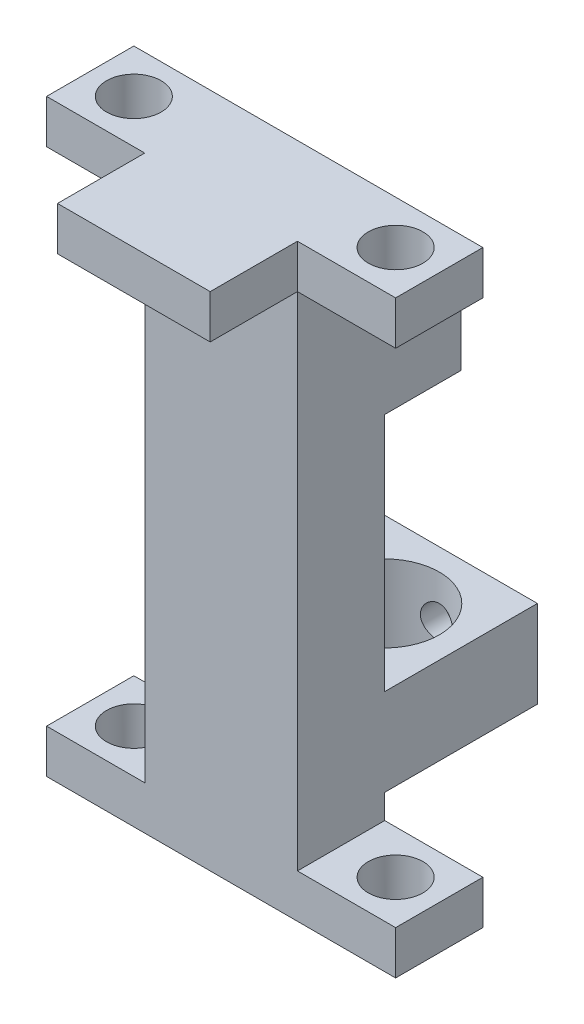
ISO-10303-21;
HEADER;
FILE_DESCRIPTION(('STEP AP214'),'2;1');
FILE_NAME('part.step','',(''),(''),'','','');
FILE_SCHEMA(('AUTOMOTIVE_DESIGN { 1 0 10303 214 1 1 1 1 }'));
ENDSEC;
DATA;
#1=APPLICATION_CONTEXT('core data for automotive mechanical design processes');
#2=APPLICATION_PROTOCOL_DEFINITION('international standard','automotive_design',2000,#1);
#3=PRODUCT_CONTEXT('',#1,'mechanical');
#4=PRODUCT('Part','Part','',(#3));
#5=PRODUCT_RELATED_PRODUCT_CATEGORY('part','',(#4));
#6=PRODUCT_DEFINITION_FORMATION('','',#4);
#7=PRODUCT_DEFINITION_CONTEXT('part definition',#1,'design');
#8=PRODUCT_DEFINITION('design','',#6,#7);
#9=PRODUCT_DEFINITION_SHAPE('','',#8);
#10=(LENGTH_UNIT() NAMED_UNIT(*) SI_UNIT(.MILLI.,.METRE.));
#11=(NAMED_UNIT(*) PLANE_ANGLE_UNIT() SI_UNIT($,.RADIAN.));
#12=(NAMED_UNIT(*) SI_UNIT($,.STERADIAN.) SOLID_ANGLE_UNIT());
#13=UNCERTAINTY_MEASURE_WITH_UNIT(LENGTH_MEASURE(1.E-05),#10,'distance_accuracy_value','');
#14=(GEOMETRIC_REPRESENTATION_CONTEXT(3) GLOBAL_UNCERTAINTY_ASSIGNED_CONTEXT((#13)) GLOBAL_UNIT_ASSIGNED_CONTEXT((#10,
#11,#12)) REPRESENTATION_CONTEXT('',''));
#15=CARTESIAN_POINT('',(0.,0.,0.));
#16=DIRECTION('',(0.,0.,1.));
#17=DIRECTION('',(1.,0.,0.));
#18=AXIS2_PLACEMENT_3D('',#15,#16,#17);
#19=CARTESIAN_POINT('',(0.,0.,-7.));
#20=DIRECTION('',(0.,0.,-1.));
#21=DIRECTION('',(-1.,0.,0.));
#22=AXIS2_PLACEMENT_3D('',#19,#20,#21);
#23=PLANE('',#22);
#24=DIRECTION('',(0.,1.,0.));
#25=VECTOR('',#24,1.);
#26=CARTESIAN_POINT('',(21.,36.2403096637996,-7.));
#27=LINE('',#26,#25);
#28=CARTESIAN_POINT('',(21.,36.2403096637996,-7.));
#29=VERTEX_POINT('',#28);
#30=CARTESIAN_POINT('',(21.,42.2403096637996,-7.));
#31=VERTEX_POINT('',#30);
#32=EDGE_CURVE('E550',#29,#31,#27,.T.);
#33=ORIENTED_EDGE('',*,*,#32,.T.);
#34=DIRECTION('',(1.,0.,0.));
#35=VECTOR('',#34,1.);
#36=CARTESIAN_POINT('',(23.,42.2403096637996,-7.));
#37=LINE('',#36,#35);
#38=CARTESIAN_POINT('',(23.,42.2403096637996,-7.));
#39=VERTEX_POINT('',#38);
#40=EDGE_CURVE('E486',#31,#39,#37,.T.);
#41=ORIENTED_EDGE('',*,*,#40,.T.);
#42=DIRECTION('',(0.,-1.,0.));
#43=VECTOR('',#42,1.);
#44=CARTESIAN_POINT('',(23.,42.2403096637996,-7.));
#45=LINE('',#44,#43);
#46=CARTESIAN_POINT('',(23.,36.2403096637996,-7.));
#47=VERTEX_POINT('',#46);
#48=EDGE_CURVE('E476',#39,#47,#45,.T.);
#49=ORIENTED_EDGE('',*,*,#48,.T.);
#50=DIRECTION('',(-1.,0.,0.));
#51=VECTOR('',#50,1.);
#52=CARTESIAN_POINT('',(23.,36.2403096637996,-7.));
#53=LINE('',#52,#51);
#54=EDGE_CURVE('E475',#47,#29,#53,.T.);
#55=ORIENTED_EDGE('',*,*,#54,.T.);
#56=EDGE_LOOP('',(#33,#41,#49,#55));
#57=FACE_BOUND('',#56,.T.);
#58=ADVANCED_FACE('F56',(#57),#23,.T.);
#59=CARTESIAN_POINT('',(0.,0.,0.));
#60=DIRECTION('',(0.,0.,1.));
#61=DIRECTION('',(1.,0.,0.));
#62=AXIS2_PLACEMENT_3D('',#59,#60,#61);
#63=PLANE('',#62);
#64=DIRECTION('',(-1.,0.,0.));
#65=VECTOR('',#64,1.);
#66=CARTESIAN_POINT('',(23.,36.2403096637996,0.));
#67=LINE('',#66,#65);
#68=CARTESIAN_POINT('',(23.,36.2403096637996,0.));
#69=VERTEX_POINT('',#68);
#70=CARTESIAN_POINT('',(9.,36.2403096637996,0.));
#71=VERTEX_POINT('',#70);
#72=EDGE_CURVE('E489',#69,#71,#67,.T.);
#73=ORIENTED_EDGE('',*,*,#72,.F.);
#74=DIRECTION('',(0.,1.,0.));
#75=VECTOR('',#74,1.);
#76=CARTESIAN_POINT('',(23.,50.,0.));
#77=LINE('',#76,#75);
#78=CARTESIAN_POINT('',(23.,14.2403096637996,0.));
#79=VERTEX_POINT('',#78);
#80=EDGE_CURVE('E356',#79,#69,#77,.T.);
#81=ORIENTED_EDGE('',*,*,#80,.F.);
#82=DIRECTION('',(1.,0.,0.));
#83=VECTOR('',#82,1.);
#84=CARTESIAN_POINT('',(23.,14.2403096637996,0.));
#85=LINE('',#84,#83);
#86=CARTESIAN_POINT('',(9.,14.2403096637996,0.));
#87=VERTEX_POINT('',#86);
#88=EDGE_CURVE('E278',#87,#79,#85,.T.);
#89=ORIENTED_EDGE('',*,*,#88,.F.);
#90=DIRECTION('',(0.,-1.,0.));
#91=VECTOR('',#90,1.);
#92=CARTESIAN_POINT('',(9.,50.,0.));
#93=LINE('',#92,#91);
#94=EDGE_CURVE('E325',#71,#87,#93,.T.);
#95=ORIENTED_EDGE('',*,*,#94,.F.);
#96=EDGE_LOOP('',(#73,#81,#89,#95));
#97=FACE_BOUND('',#96,.T.);
#98=ADVANCED_FACE('F436',(#97),#63,.F.);
#99=DIRECTION('',(1.,0.,0.));
#100=VECTOR('',#99,1.);
#101=CARTESIAN_POINT('',(23.,42.2403096637996,0.));
#102=LINE('',#101,#100);
#103=CARTESIAN_POINT('',(9.,42.2403096637996,0.));
#104=VERTEX_POINT('',#103);
#105=CARTESIAN_POINT('',(23.,42.2403096637996,0.));
#106=VERTEX_POINT('',#105);
#107=EDGE_CURVE('E481',#104,#106,#102,.T.);
#108=ORIENTED_EDGE('',*,*,#107,.F.);
#109=CARTESIAN_POINT('',(9.,50.,0.));
#110=VERTEX_POINT('',#109);
#111=EDGE_CURVE('E321',#110,#104,#93,.T.);
#112=ORIENTED_EDGE('',*,*,#111,.F.);
#113=DIRECTION('',(-1.,0.,0.));
#114=VECTOR('',#113,1.);
#115=CARTESIAN_POINT('',(9.,50.,0.));
#116=LINE('',#115,#114);
#117=CARTESIAN_POINT('',(0.,50.,0.));
#118=VERTEX_POINT('',#117);
#119=EDGE_CURVE('E337',#110,#118,#116,.T.);
#120=ORIENTED_EDGE('',*,*,#119,.T.);
#121=DIRECTION('',(0.,1.,0.));
#122=VECTOR('',#121,1.);
#123=CARTESIAN_POINT('',(0.,0.,0.));
#124=LINE('',#123,#122);
#125=CARTESIAN_POINT('',(0.,54.,0.));
#126=VERTEX_POINT('',#125);
#127=EDGE_CURVE('E396',#118,#126,#124,.T.);
#128=ORIENTED_EDGE('',*,*,#127,.T.);
#129=DIRECTION('',(1.,0.,0.));
#130=VECTOR('',#129,1.);
#131=CARTESIAN_POINT('',(0.,54.,0.));
#132=LINE('',#131,#130);
#133=CARTESIAN_POINT('',(32.,54.,0.));
#134=VERTEX_POINT('',#133);
#135=EDGE_CURVE('E393',#126,#134,#132,.T.);
#136=ORIENTED_EDGE('',*,*,#135,.T.);
#137=DIRECTION('',(0.,1.,0.));
#138=VECTOR('',#137,1.);
#139=CARTESIAN_POINT('',(32.,0.,0.));
#140=LINE('',#139,#138);
#141=CARTESIAN_POINT('',(32.,50.,0.));
#142=VERTEX_POINT('',#141);
#143=EDGE_CURVE('E389',#142,#134,#140,.T.);
#144=ORIENTED_EDGE('',*,*,#143,.F.);
#145=DIRECTION('',(1.,0.,0.));
#146=VECTOR('',#145,1.);
#147=CARTESIAN_POINT('',(23.,50.,0.));
#148=LINE('',#147,#146);
#149=CARTESIAN_POINT('',(23.,50.,0.));
#150=VERTEX_POINT('',#149);
#151=EDGE_CURVE('E361',#150,#142,#148,.T.);
#152=ORIENTED_EDGE('',*,*,#151,.F.);
#153=EDGE_CURVE('E351',#106,#150,#77,.T.);
#154=ORIENTED_EDGE('',*,*,#153,.F.);
#155=EDGE_LOOP('',(#108,#112,#120,#128,#136,#144,#152,#154));
#156=FACE_BOUND('',#155,.T.);
#157=ADVANCED_FACE('F442',(#156),#63,.F.);
#158=CARTESIAN_POINT('',(0.,50.,18.));
#159=DIRECTION('',(0.,1.,0.));
#160=DIRECTION('',(0.,0.,1.));
#161=AXIS2_PLACEMENT_3D('',#158,#159,#160);
#162=PLANE('',#161);
#163=DIRECTION('',(0.,0.,1.));
#164=VECTOR('',#163,1.);
#165=CARTESIAN_POINT('',(23.,50.,18.));
#166=LINE('',#165,#164);
#167=CARTESIAN_POINT('',(23.,50.,8.));
#168=VERTEX_POINT('',#167);
#169=CARTESIAN_POINT('',(23.,50.,16.));
#170=VERTEX_POINT('',#169);
#171=EDGE_CURVE('E250',#168,#170,#166,.T.);
#172=ORIENTED_EDGE('',*,*,#171,.T.);
#173=DIRECTION('',(-1.,0.,0.));
#174=VECTOR('',#173,1.);
#175=CARTESIAN_POINT('',(0.,50.,16.));
#176=LINE('',#175,#174);
#177=CARTESIAN_POINT('',(9.,50.,16.));
#178=VERTEX_POINT('',#177);
#179=EDGE_CURVE('E71',#170,#178,#176,.T.);
#180=ORIENTED_EDGE('',*,*,#179,.T.);
#181=DIRECTION('',(0.,0.,-1.));
#182=VECTOR('',#181,1.);
#183=CARTESIAN_POINT('',(9.,50.,18.));
#184=LINE('',#183,#182);
#185=CARTESIAN_POINT('',(9.,50.,8.));
#186=VERTEX_POINT('',#185);
#187=EDGE_CURVE('E263',#178,#186,#184,.T.);
#188=ORIENTED_EDGE('',*,*,#187,.T.);
#189=DIRECTION('',(1.,0.,0.));
#190=VECTOR('',#189,1.);
#191=CARTESIAN_POINT('',(0.,50.,8.));
#192=LINE('',#191,#190);
#193=EDGE_CURVE('E364',#186,#168,#192,.T.);
#194=ORIENTED_EDGE('',*,*,#193,.T.);
#195=EDGE_LOOP('',(#172,#180,#188,#194));
#196=FACE_BOUND('',#195,.T.);
#197=ADVANCED_FACE('F508',(#196),#162,.F.);
#198=CARTESIAN_POINT('',(4.,50.,4.));
#199=DIRECTION('',(0.,1.,0.));
#200=DIRECTION('',(0.,0.,1.));
#201=AXIS2_PLACEMENT_3D('',#198,#199,#200);
#202=CIRCLE('',#201,2.5);
#203=CARTESIAN_POINT('',(4.,50.,6.5));
#204=VERTEX_POINT('',#203);
#205=EDGE_CURVE('E313',#204,#204,#202,.T.);
#206=ORIENTED_EDGE('',*,*,#205,.T.);
#207=EDGE_LOOP('',(#206));
#208=FACE_BOUND('',#207,.T.);
#209=DIRECTION('',(0.,0.,-1.));
#210=VECTOR('',#209,1.);
#211=CARTESIAN_POINT('',(9.,50.,0.));
#212=LINE('',#211,#210);
#213=EDGE_CURVE('E332',#186,#110,#212,.T.);
#214=ORIENTED_EDGE('',*,*,#213,.F.);
#215=DIRECTION('',(-1.,0.,0.));
#216=VECTOR('',#215,1.);
#217=CARTESIAN_POINT('',(0.,50.,8.));
#218=LINE('',#217,#216);
#219=CARTESIAN_POINT('',(0.,50.,8.));
#220=VERTEX_POINT('',#219);
#221=EDGE_CURVE('E265',#186,#220,#218,.T.);
#222=ORIENTED_EDGE('',*,*,#221,.T.);
#223=DIRECTION('',(0.,0.,-1.));
#224=VECTOR('',#223,1.);
#225=CARTESIAN_POINT('',(0.,50.,18.));
#226=LINE('',#225,#224);
#227=EDGE_CURVE('E373',#220,#118,#226,.T.);
#228=ORIENTED_EDGE('',*,*,#227,.T.);
#229=ORIENTED_EDGE('',*,*,#119,.F.);
#230=EDGE_LOOP('',(#214,#222,#228,#229));
#231=FACE_BOUND('',#230,.T.);
#232=ADVANCED_FACE('F560',(#208,#231),#162,.F.);
#233=DIRECTION('',(-1.,0.,0.));
#234=VECTOR('',#233,1.);
#235=CARTESIAN_POINT('',(23.,6.24030966379959,0.));
#236=LINE('',#235,#234);
#237=CARTESIAN_POINT('',(23.,6.24030966379959,0.));
#238=VERTEX_POINT('',#237);
#239=CARTESIAN_POINT('',(9.,6.24030966379959,0.));
#240=VERTEX_POINT('',#239);
#241=EDGE_CURVE('E260',#238,#240,#236,.T.);
#242=ORIENTED_EDGE('',*,*,#241,.F.);
#243=CARTESIAN_POINT('',(23.,4.,0.));
#244=VERTEX_POINT('',#243);
#245=EDGE_CURVE('E352',#244,#238,#77,.T.);
#246=ORIENTED_EDGE('',*,*,#245,.F.);
#247=DIRECTION('',(1.,0.,0.));
#248=VECTOR('',#247,1.);
#249=CARTESIAN_POINT('',(23.,4.,0.));
#250=LINE('',#249,#248);
#251=CARTESIAN_POINT('',(32.,4.,0.));
#252=VERTEX_POINT('',#251);
#253=EDGE_CURVE('E365',#244,#252,#250,.T.);
#254=ORIENTED_EDGE('',*,*,#253,.T.);
#255=CARTESIAN_POINT('',(32.,0.,0.));
#256=VERTEX_POINT('',#255);
#257=EDGE_CURVE('E390',#256,#252,#140,.T.);
#258=ORIENTED_EDGE('',*,*,#257,.F.);
#259=DIRECTION('',(1.,0.,0.));
#260=VECTOR('',#259,1.);
#261=CARTESIAN_POINT('',(0.,0.,0.));
#262=LINE('',#261,#260);
#263=CARTESIAN_POINT('',(0.,0.,0.));
#264=VERTEX_POINT('',#263);
#265=EDGE_CURVE('E375',#264,#256,#262,.T.);
#266=ORIENTED_EDGE('',*,*,#265,.F.);
#267=CARTESIAN_POINT('',(0.,4.,0.));
#268=VERTEX_POINT('',#267);
#269=EDGE_CURVE('E380',#264,#268,#124,.T.);
#270=ORIENTED_EDGE('',*,*,#269,.T.);
#271=DIRECTION('',(-1.,0.,0.));
#272=VECTOR('',#271,1.);
#273=CARTESIAN_POINT('',(9.,4.,0.));
#274=LINE('',#273,#272);
#275=CARTESIAN_POINT('',(9.,4.,0.));
#276=VERTEX_POINT('',#275);
#277=EDGE_CURVE('E335',#276,#268,#274,.T.);
#278=ORIENTED_EDGE('',*,*,#277,.F.);
#279=EDGE_CURVE('E326',#240,#276,#93,.T.);
#280=ORIENTED_EDGE('',*,*,#279,.F.);
#281=EDGE_LOOP('',(#242,#246,#254,#258,#266,#270,#278,#280));
#282=FACE_BOUND('',#281,.T.);
#283=ADVANCED_FACE('F445',(#282),#63,.F.);
#284=CARTESIAN_POINT('',(0.,0.,8.));
#285=DIRECTION('',(-1.,0.,0.));
#286=DIRECTION('',(0.,0.,1.));
#287=AXIS2_PLACEMENT_3D('',#284,#285,#286);
#288=PLANE('',#287);
#289=DIRECTION('',(0.,1.,0.));
#290=VECTOR('',#289,1.);
#291=CARTESIAN_POINT('',(0.,50.,8.));
#292=LINE('',#291,#290);
#293=CARTESIAN_POINT('',(0.,54.,8.));
#294=VERTEX_POINT('',#293);
#295=EDGE_CURVE('E248',#220,#294,#292,.T.);
#296=ORIENTED_EDGE('',*,*,#295,.T.);
#297=DIRECTION('',(0.,0.,-1.));
#298=VECTOR('',#297,1.);
#299=CARTESIAN_POINT('',(0.,54.,8.));
#300=LINE('',#299,#298);
#301=EDGE_CURVE('E400',#294,#126,#300,.T.);
#302=ORIENTED_EDGE('',*,*,#301,.T.);
#303=ORIENTED_EDGE('',*,*,#127,.F.);
#304=ORIENTED_EDGE('',*,*,#227,.F.);
#305=EDGE_LOOP('',(#296,#302,#303,#304));
#306=FACE_BOUND('',#305,.T.);
#307=ADVANCED_FACE('F567',(#306),#288,.T.);
#308=CARTESIAN_POINT('',(32.,0.,8.));
#309=DIRECTION('',(-1.,0.,0.));
#310=DIRECTION('',(0.,0.,1.));
#311=AXIS2_PLACEMENT_3D('',#308,#309,#310);
#312=PLANE('',#311);
#313=DIRECTION('',(0.,0.,-1.));
#314=VECTOR('',#313,1.);
#315=CARTESIAN_POINT('',(32.,54.,8.));
#316=LINE('',#315,#314);
#317=CARTESIAN_POINT('',(32.,54.,8.));
#318=VERTEX_POINT('',#317);
#319=EDGE_CURVE('E402',#318,#134,#316,.T.);
#320=ORIENTED_EDGE('',*,*,#319,.F.);
#321=DIRECTION('',(0.,1.,0.));
#322=VECTOR('',#321,1.);
#323=CARTESIAN_POINT('',(32.,50.,8.));
#324=LINE('',#323,#322);
#325=CARTESIAN_POINT('',(32.,50.,8.));
#326=VERTEX_POINT('',#325);
#327=EDGE_CURVE('E261',#326,#318,#324,.T.);
#328=ORIENTED_EDGE('',*,*,#327,.F.);
#329=DIRECTION('',(0.,0.,-1.));
#330=VECTOR('',#329,1.);
#331=CARTESIAN_POINT('',(32.,50.,18.));
#332=LINE('',#331,#330);
#333=EDGE_CURVE('E371',#326,#142,#332,.T.);
#334=ORIENTED_EDGE('',*,*,#333,.T.);
#335=ORIENTED_EDGE('',*,*,#143,.T.);
#336=EDGE_LOOP('',(#320,#328,#334,#335));
#337=FACE_BOUND('',#336,.T.);
#338=ADVANCED_FACE('F573',(#337),#312,.F.);
#339=CARTESIAN_POINT('',(0.,0.,8.));
#340=DIRECTION('',(0.,1.,0.));
#341=DIRECTION('',(0.,0.,1.));
#342=AXIS2_PLACEMENT_3D('',#339,#340,#341);
#343=PLANE('',#342);
#344=CARTESIAN_POINT('',(4.,0.,4.));
#345=DIRECTION('',(0.,1.,0.));
#346=DIRECTION('',(0.,0.,1.));
#347=AXIS2_PLACEMENT_3D('',#344,#345,#346);
#348=CIRCLE('',#347,2.5);
#349=CARTESIAN_POINT('',(4.,0.,6.5));
#350=VERTEX_POINT('',#349);
#351=EDGE_CURVE('E301',#350,#350,#348,.T.);
#352=ORIENTED_EDGE('',*,*,#351,.T.);
#353=EDGE_LOOP('',(#352));
#354=FACE_BOUND('',#353,.T.);
#355=CARTESIAN_POINT('',(28.,0.,4.));
#356=DIRECTION('',(0.,1.,0.));
#357=DIRECTION('',(0.,0.,1.));
#358=AXIS2_PLACEMENT_3D('',#355,#356,#357);
#359=CIRCLE('',#358,2.5);
#360=CARTESIAN_POINT('',(28.,0.,6.5));
#361=VERTEX_POINT('',#360);
#362=EDGE_CURVE('E308',#361,#361,#359,.T.);
#363=ORIENTED_EDGE('',*,*,#362,.T.);
#364=EDGE_LOOP('',(#363));
#365=FACE_BOUND('',#364,.T.);
#366=ORIENTED_EDGE('',*,*,#265,.T.);
#367=DIRECTION('',(0.,0.,-1.));
#368=VECTOR('',#367,1.);
#369=CARTESIAN_POINT('',(32.,0.,8.));
#370=LINE('',#369,#368);
#371=CARTESIAN_POINT('',(32.,0.,8.));
#372=VERTEX_POINT('',#371);
#373=EDGE_CURVE('E64',#372,#256,#370,.T.);
#374=ORIENTED_EDGE('',*,*,#373,.F.);
#375=DIRECTION('',(1.,0.,0.));
#376=VECTOR('',#375,1.);
#377=CARTESIAN_POINT('',(0.,0.,8.));
#378=LINE('',#377,#376);
#379=CARTESIAN_POINT('',(0.,0.,8.));
#380=VERTEX_POINT('',#379);
#381=EDGE_CURVE('E376',#380,#372,#378,.T.);
#382=ORIENTED_EDGE('',*,*,#381,.F.);
#383=DIRECTION('',(0.,0.,-1.));
#384=VECTOR('',#383,1.);
#385=CARTESIAN_POINT('',(0.,0.,8.));
#386=LINE('',#385,#384);
#387=EDGE_CURVE('E386',#380,#264,#386,.T.);
#388=ORIENTED_EDGE('',*,*,#387,.T.);
#389=EDGE_LOOP('',(#366,#374,#382,#388));
#390=FACE_BOUND('',#389,.T.);
#391=ADVANCED_FACE('F58',(#354,#365,#390),#343,.F.);
#392=ORIENTED_EDGE('',*,*,#257,.T.);
#393=DIRECTION('',(0.,0.,-1.));
#394=VECTOR('',#393,1.);
#395=CARTESIAN_POINT('',(32.,4.,8.));
#396=LINE('',#395,#394);
#397=CARTESIAN_POINT('',(32.,4.,8.));
#398=VERTEX_POINT('',#397);
#399=EDGE_CURVE('E340',#398,#252,#396,.T.);
#400=ORIENTED_EDGE('',*,*,#399,.F.);
#401=DIRECTION('',(0.,1.,0.));
#402=VECTOR('',#401,1.);
#403=CARTESIAN_POINT('',(32.,0.,8.));
#404=LINE('',#403,#402);
#405=EDGE_CURVE('E379',#372,#398,#404,.T.);
#406=ORIENTED_EDGE('',*,*,#405,.F.);
#407=ORIENTED_EDGE('',*,*,#373,.T.);
#408=EDGE_LOOP('',(#392,#400,#406,#407));
#409=FACE_BOUND('',#408,.T.);
#410=ADVANCED_FACE('F523',(#409),#312,.F.);
#411=CARTESIAN_POINT('',(0.,54.,8.));
#412=DIRECTION('',(0.,1.,0.));
#413=DIRECTION('',(0.,0.,1.));
#414=AXIS2_PLACEMENT_3D('',#411,#412,#413);
#415=PLANE('',#414);
#416=DIRECTION('',(-1.,0.,0.));
#417=VECTOR('',#416,1.);
#418=CARTESIAN_POINT('',(9.,54.,16.));
#419=LINE('',#418,#417);
#420=CARTESIAN_POINT('',(23.,54.,16.));
#421=VERTEX_POINT('',#420);
#422=CARTESIAN_POINT('',(9.,54.,16.));
#423=VERTEX_POINT('',#422);
#424=EDGE_CURVE('E227',#421,#423,#419,.T.);
#425=ORIENTED_EDGE('',*,*,#424,.F.);
#426=DIRECTION('',(0.,0.,1.));
#427=VECTOR('',#426,1.);
#428=CARTESIAN_POINT('',(23.,54.,18.));
#429=LINE('',#428,#427);
#430=CARTESIAN_POINT('',(23.,54.,8.));
#431=VERTEX_POINT('',#430);
#432=EDGE_CURVE('E239',#431,#421,#429,.T.);
#433=ORIENTED_EDGE('',*,*,#432,.F.);
#434=DIRECTION('',(-1.,0.,0.));
#435=VECTOR('',#434,1.);
#436=CARTESIAN_POINT('',(23.,54.,8.));
#437=LINE('',#436,#435);
#438=EDGE_CURVE('E247',#318,#431,#437,.T.);
#439=ORIENTED_EDGE('',*,*,#438,.F.);
#440=ORIENTED_EDGE('',*,*,#319,.T.);
#441=ORIENTED_EDGE('',*,*,#135,.F.);
#442=ORIENTED_EDGE('',*,*,#301,.F.);
#443=DIRECTION('',(-1.,0.,0.));
#444=VECTOR('',#443,1.);
#445=CARTESIAN_POINT('',(0.,54.,8.));
#446=LINE('',#445,#444);
#447=CARTESIAN_POINT('',(9.,54.,8.));
#448=VERTEX_POINT('',#447);
#449=EDGE_CURVE('E266',#448,#294,#446,.T.);
#450=ORIENTED_EDGE('',*,*,#449,.F.);
#451=DIRECTION('',(0.,0.,-1.));
#452=VECTOR('',#451,1.);
#453=CARTESIAN_POINT('',(9.,54.,18.));
#454=LINE('',#453,#452);
#455=EDGE_CURVE('E241',#423,#448,#454,.T.);
#456=ORIENTED_EDGE('',*,*,#455,.F.);
#457=EDGE_LOOP('',(#425,#433,#439,#440,#441,#442,#450,#456));
#458=FACE_BOUND('',#457,.T.);
#459=CARTESIAN_POINT('',(4.,54.,4.));
#460=DIRECTION('',(0.,1.,0.));
#461=DIRECTION('',(0.,0.,1.));
#462=AXIS2_PLACEMENT_3D('',#459,#460,#461);
#463=CIRCLE('',#462,2.5);
#464=CARTESIAN_POINT('',(4.,54.,6.5));
#465=VERTEX_POINT('',#464);
#466=EDGE_CURVE('E305',#465,#465,#463,.T.);
#467=ORIENTED_EDGE('',*,*,#466,.F.);
#468=EDGE_LOOP('',(#467));
#469=FACE_BOUND('',#468,.T.);
#470=CARTESIAN_POINT('',(28.,54.,4.));
#471=DIRECTION('',(0.,1.,0.));
#472=DIRECTION('',(0.,0.,1.));
#473=AXIS2_PLACEMENT_3D('',#470,#471,#472);
#474=CIRCLE('',#473,2.5);
#475=CARTESIAN_POINT('',(28.,54.,6.5));
#476=VERTEX_POINT('',#475);
#477=EDGE_CURVE('E300',#476,#476,#474,.T.);
#478=ORIENTED_EDGE('',*,*,#477,.F.);
#479=EDGE_LOOP('',(#478));
#480=FACE_BOUND('',#479,.T.);
#481=ADVANCED_FACE('F236',(#458,#469,#480),#415,.T.);
#482=DIRECTION('',(0.,0.,1.));
#483=VECTOR('',#482,1.);
#484=CARTESIAN_POINT('',(0.,4.,0.));
#485=LINE('',#484,#483);
#486=CARTESIAN_POINT('',(0.,4.,8.));
#487=VERTEX_POINT('',#486);
#488=EDGE_CURVE('E320',#268,#487,#485,.T.);
#489=ORIENTED_EDGE('',*,*,#488,.F.);
#490=ORIENTED_EDGE('',*,*,#269,.F.);
#491=ORIENTED_EDGE('',*,*,#387,.F.);
#492=DIRECTION('',(0.,1.,0.));
#493=VECTOR('',#492,1.);
#494=CARTESIAN_POINT('',(0.,0.,8.));
#495=LINE('',#494,#493);
#496=EDGE_CURVE('E383',#380,#487,#495,.T.);
#497=ORIENTED_EDGE('',*,*,#496,.T.);
#498=EDGE_LOOP('',(#489,#490,#491,#497));
#499=FACE_BOUND('',#498,.T.);
#500=ADVANCED_FACE('F627',(#499),#288,.T.);
#501=CARTESIAN_POINT('',(0.,0.,8.));
#502=DIRECTION('',(0.,0.,1.));
#503=DIRECTION('',(1.,0.,0.));
#504=AXIS2_PLACEMENT_3D('',#501,#502,#503);
#505=PLANE('',#504);
#506=DIRECTION('',(-1.,0.,0.));
#507=VECTOR('',#506,1.);
#508=CARTESIAN_POINT('',(9.,4.,8.));
#509=LINE('',#508,#507);
#510=CARTESIAN_POINT('',(9.,4.,8.));
#511=VERTEX_POINT('',#510);
#512=EDGE_CURVE('E341',#511,#487,#509,.T.);
#513=ORIENTED_EDGE('',*,*,#512,.T.);
#514=ORIENTED_EDGE('',*,*,#496,.F.);
#515=ORIENTED_EDGE('',*,*,#381,.T.);
#516=ORIENTED_EDGE('',*,*,#405,.T.);
#517=DIRECTION('',(1.,0.,0.));
#518=VECTOR('',#517,1.);
#519=CARTESIAN_POINT('',(23.,4.,8.));
#520=LINE('',#519,#518);
#521=CARTESIAN_POINT('',(23.,4.,8.));
#522=VERTEX_POINT('',#521);
#523=EDGE_CURVE('E359',#522,#398,#520,.T.);
#524=ORIENTED_EDGE('',*,*,#523,.F.);
#525=DIRECTION('',(0.,-1.,0.));
#526=VECTOR('',#525,1.);
#527=CARTESIAN_POINT('',(23.,50.,8.));
#528=LINE('',#527,#526);
#529=EDGE_CURVE('E345',#168,#522,#528,.T.);
#530=ORIENTED_EDGE('',*,*,#529,.F.);
#531=ORIENTED_EDGE('',*,*,#193,.F.);
#532=DIRECTION('',(0.,1.,0.));
#533=VECTOR('',#532,1.);
#534=CARTESIAN_POINT('',(9.,50.,8.));
#535=LINE('',#534,#533);
#536=EDGE_CURVE('E329',#511,#186,#535,.T.);
#537=ORIENTED_EDGE('',*,*,#536,.F.);
#538=EDGE_LOOP('',(#513,#514,#515,#516,#524,#530,#531,#537));
#539=FACE_BOUND('',#538,.T.);
#540=ADVANCED_FACE('F518',(#539),#505,.T.);
#541=CARTESIAN_POINT('',(28.,50.,4.));
#542=DIRECTION('',(0.,1.,0.));
#543=DIRECTION('',(0.,0.,1.));
#544=AXIS2_PLACEMENT_3D('',#541,#542,#543);
#545=CIRCLE('',#544,2.5);
#546=CARTESIAN_POINT('',(28.,50.,6.5));
#547=VERTEX_POINT('',#546);
#548=EDGE_CURVE('E317',#547,#547,#545,.T.);
#549=ORIENTED_EDGE('',*,*,#548,.T.);
#550=EDGE_LOOP('',(#549));
#551=FACE_BOUND('',#550,.T.);
#552=ORIENTED_EDGE('',*,*,#333,.F.);
#553=DIRECTION('',(-1.,0.,0.));
#554=VECTOR('',#553,1.);
#555=CARTESIAN_POINT('',(23.,50.,8.));
#556=LINE('',#555,#554);
#557=EDGE_CURVE('E256',#326,#168,#556,.T.);
#558=ORIENTED_EDGE('',*,*,#557,.T.);
#559=DIRECTION('',(0.,0.,1.));
#560=VECTOR('',#559,1.);
#561=CARTESIAN_POINT('',(23.,50.,8.));
#562=LINE('',#561,#560);
#563=EDGE_CURVE('E355',#150,#168,#562,.T.);
#564=ORIENTED_EDGE('',*,*,#563,.F.);
#565=ORIENTED_EDGE('',*,*,#151,.T.);
#566=EDGE_LOOP('',(#552,#558,#564,#565));
#567=FACE_BOUND('',#566,.T.);
#568=ADVANCED_FACE('F503',(#551,#567),#162,.F.);
#569=CARTESIAN_POINT('',(23.,4.,8.));
#570=DIRECTION('',(0.,-1.,0.));
#571=DIRECTION('',(0.,0.,-1.));
#572=AXIS2_PLACEMENT_3D('',#569,#570,#571);
#573=PLANE('',#572);
#574=CARTESIAN_POINT('',(28.,4.,4.));
#575=DIRECTION('',(0.,-1.,0.));
#576=DIRECTION('',(0.,0.,-1.));
#577=AXIS2_PLACEMENT_3D('',#574,#575,#576);
#578=CIRCLE('',#577,2.5);
#579=CARTESIAN_POINT('',(28.,4.,1.5));
#580=VERTEX_POINT('',#579);
#581=EDGE_CURVE('E316',#580,#580,#578,.T.);
#582=ORIENTED_EDGE('',*,*,#581,.T.);
#583=EDGE_LOOP('',(#582));
#584=FACE_BOUND('',#583,.T.);
#585=ORIENTED_EDGE('',*,*,#399,.T.);
#586=ORIENTED_EDGE('',*,*,#253,.F.);
#587=DIRECTION('',(0.,0.,-1.));
#588=VECTOR('',#587,1.);
#589=CARTESIAN_POINT('',(23.,4.,8.));
#590=LINE('',#589,#588);
#591=EDGE_CURVE('E348',#522,#244,#590,.T.);
#592=ORIENTED_EDGE('',*,*,#591,.F.);
#593=ORIENTED_EDGE('',*,*,#523,.T.);
#594=EDGE_LOOP('',(#585,#586,#592,#593));
#595=FACE_BOUND('',#594,.T.);
#596=ADVANCED_FACE('F521',(#584,#595),#573,.F.);
#597=CARTESIAN_POINT('',(23.,0.,0.));
#598=DIRECTION('',(1.,0.,0.));
#599=DIRECTION('',(0.,0.,-1.));
#600=AXIS2_PLACEMENT_3D('',#597,#598,#599);
#601=PLANE('',#600);
#602=ORIENTED_EDGE('',*,*,#529,.T.);
#603=ORIENTED_EDGE('',*,*,#591,.T.);
#604=ORIENTED_EDGE('',*,*,#245,.T.);
#605=DIRECTION('',(0.,0.,1.));
#606=VECTOR('',#605,1.);
#607=CARTESIAN_POINT('',(23.,6.24030966379959,-14.));
#608=LINE('',#607,#606);
#609=CARTESIAN_POINT('',(23.,6.24030966379959,-14.));
#610=VERTEX_POINT('',#609);
#611=EDGE_CURVE('E297',#610,#238,#608,.T.);
#612=ORIENTED_EDGE('',*,*,#611,.F.);
#613=DIRECTION('',(0.,-1.,0.));
#614=VECTOR('',#613,1.);
#615=CARTESIAN_POINT('',(23.,14.2403096637996,-14.));
#616=LINE('',#615,#614);
#617=CARTESIAN_POINT('',(23.,14.2403096637996,-14.));
#618=VERTEX_POINT('',#617);
#619=EDGE_CURVE('E274',#618,#610,#616,.T.);
#620=ORIENTED_EDGE('',*,*,#619,.F.);
#621=DIRECTION('',(0.,0.,1.));
#622=VECTOR('',#621,1.);
#623=CARTESIAN_POINT('',(23.,14.2403096637996,-14.));
#624=LINE('',#623,#622);
#625=EDGE_CURVE('E284',#618,#79,#624,.T.);
#626=ORIENTED_EDGE('',*,*,#625,.T.);
#627=ORIENTED_EDGE('',*,*,#80,.T.);
#628=DIRECTION('',(0.,0.,1.));
#629=VECTOR('',#628,1.);
#630=CARTESIAN_POINT('',(23.,36.2403096637996,-7.));
#631=LINE('',#630,#629);
#632=EDGE_CURVE('E270',#47,#69,#631,.T.);
#633=ORIENTED_EDGE('',*,*,#632,.F.);
#634=ORIENTED_EDGE('',*,*,#48,.F.);
#635=DIRECTION('',(0.,0.,1.));
#636=VECTOR('',#635,1.);
#637=CARTESIAN_POINT('',(23.,42.2403096637996,-7.));
#638=LINE('',#637,#636);
#639=EDGE_CURVE('E488',#39,#106,#638,.T.);
#640=ORIENTED_EDGE('',*,*,#639,.T.);
#641=ORIENTED_EDGE('',*,*,#153,.T.);
#642=ORIENTED_EDGE('',*,*,#563,.T.);
#643=EDGE_LOOP('',(#602,#603,#604,#612,#620,#626,#627,#633,#634,#640,#641,#642));
#644=FACE_BOUND('',#643,.T.);
#645=ADVANCED_FACE('F515',(#644),#601,.T.);
#646=CARTESIAN_POINT('',(9.,4.,0.));
#647=DIRECTION('',(0.,-1.,0.));
#648=DIRECTION('',(0.,0.,-1.));
#649=AXIS2_PLACEMENT_3D('',#646,#647,#648);
#650=PLANE('',#649);
#651=CARTESIAN_POINT('',(4.,4.,4.));
#652=DIRECTION('',(0.,-1.,0.));
#653=DIRECTION('',(0.,0.,-1.));
#654=AXIS2_PLACEMENT_3D('',#651,#652,#653);
#655=CIRCLE('',#654,2.5);
#656=CARTESIAN_POINT('',(4.,4.,1.5));
#657=VERTEX_POINT('',#656);
#658=EDGE_CURVE('E304',#657,#657,#655,.T.);
#659=ORIENTED_EDGE('',*,*,#658,.T.);
#660=EDGE_LOOP('',(#659));
#661=FACE_BOUND('',#660,.T.);
#662=ORIENTED_EDGE('',*,*,#488,.T.);
#663=ORIENTED_EDGE('',*,*,#512,.F.);
#664=DIRECTION('',(0.,0.,1.));
#665=VECTOR('',#664,1.);
#666=CARTESIAN_POINT('',(9.,4.,0.));
#667=LINE('',#666,#665);
#668=EDGE_CURVE('E324',#276,#511,#667,.T.);
#669=ORIENTED_EDGE('',*,*,#668,.F.);
#670=ORIENTED_EDGE('',*,*,#277,.T.);
#671=EDGE_LOOP('',(#662,#663,#669,#670));
#672=FACE_BOUND('',#671,.T.);
#673=ADVANCED_FACE('F614',(#661,#672),#650,.F.);
#674=CARTESIAN_POINT('',(9.,0.,0.));
#675=DIRECTION('',(-1.,0.,0.));
#676=DIRECTION('',(0.,0.,1.));
#677=AXIS2_PLACEMENT_3D('',#674,#675,#676);
#678=PLANE('',#677);
#679=ORIENTED_EDGE('',*,*,#111,.T.);
#680=DIRECTION('',(0.,0.,1.));
#681=VECTOR('',#680,1.);
#682=CARTESIAN_POINT('',(9.,42.2403096637996,-7.));
#683=LINE('',#682,#681);
#684=CARTESIAN_POINT('',(9.,42.2403096637996,-7.));
#685=VERTEX_POINT('',#684);
#686=EDGE_CURVE('E495',#685,#104,#683,.T.);
#687=ORIENTED_EDGE('',*,*,#686,.F.);
#688=DIRECTION('',(0.,1.,0.));
#689=VECTOR('',#688,1.);
#690=CARTESIAN_POINT('',(9.,42.2403096637996,-7.));
#691=LINE('',#690,#689);
#692=CARTESIAN_POINT('',(9.,36.2403096637996,-7.));
#693=VERTEX_POINT('',#692);
#694=EDGE_CURVE('E479',#693,#685,#691,.T.);
#695=ORIENTED_EDGE('',*,*,#694,.F.);
#696=DIRECTION('',(0.,0.,1.));
#697=VECTOR('',#696,1.);
#698=CARTESIAN_POINT('',(9.,36.2403096637996,-7.));
#699=LINE('',#698,#697);
#700=EDGE_CURVE('E473',#693,#71,#699,.T.);
#701=ORIENTED_EDGE('',*,*,#700,.T.);
#702=ORIENTED_EDGE('',*,*,#94,.T.);
#703=DIRECTION('',(0.,0.,1.));
#704=VECTOR('',#703,1.);
#705=CARTESIAN_POINT('',(9.,14.2403096637996,-14.));
#706=LINE('',#705,#704);
#707=CARTESIAN_POINT('',(9.,14.2403096637996,-14.));
#708=VERTEX_POINT('',#707);
#709=EDGE_CURVE('E291',#708,#87,#706,.T.);
#710=ORIENTED_EDGE('',*,*,#709,.F.);
#711=DIRECTION('',(0.,1.,0.));
#712=VECTOR('',#711,1.);
#713=CARTESIAN_POINT('',(9.,14.2403096637996,-14.));
#714=LINE('',#713,#712);
#715=CARTESIAN_POINT('',(9.,6.24030966379959,-14.));
#716=VERTEX_POINT('',#715);
#717=EDGE_CURVE('E280',#716,#708,#714,.T.);
#718=ORIENTED_EDGE('',*,*,#717,.F.);
#719=DIRECTION('',(0.,0.,1.));
#720=VECTOR('',#719,1.);
#721=CARTESIAN_POINT('',(9.,6.24030966379959,-14.));
#722=LINE('',#721,#720);
#723=EDGE_CURVE('E294',#716,#240,#722,.T.);
#724=ORIENTED_EDGE('',*,*,#723,.T.);
#725=ORIENTED_EDGE('',*,*,#279,.T.);
#726=ORIENTED_EDGE('',*,*,#668,.T.);
#727=ORIENTED_EDGE('',*,*,#536,.T.);
#728=ORIENTED_EDGE('',*,*,#213,.T.);
#729=EDGE_LOOP('',(#679,#687,#695,#701,#702,#710,#718,#724,#725,#726,#727,#728));
#730=FACE_BOUND('',#729,.T.);
#731=ADVANCED_FACE('F557',(#730),#678,.T.);
#732=CARTESIAN_POINT('',(4.,0.,4.));
#733=DIRECTION('',(0.,1.,0.));
#734=DIRECTION('',(0.,0.,1.));
#735=AXIS2_PLACEMENT_3D('',#732,#733,#734);
#736=CYLINDRICAL_SURFACE('',#735,2.5);
#737=ORIENTED_EDGE('',*,*,#351,.F.);
#738=EDGE_LOOP('',(#737));
#739=FACE_BOUND('',#738,.T.);
#740=ORIENTED_EDGE('',*,*,#658,.F.);
#741=EDGE_LOOP('',(#740));
#742=FACE_BOUND('',#741,.T.);
#743=ADVANCED_FACE('F607',(#739,#742),#736,.F.);
#744=CARTESIAN_POINT('',(28.,0.,4.));
#745=DIRECTION('',(0.,1.,0.));
#746=DIRECTION('',(0.,0.,1.));
#747=AXIS2_PLACEMENT_3D('',#744,#745,#746);
#748=CYLINDRICAL_SURFACE('',#747,2.5);
#749=ORIENTED_EDGE('',*,*,#362,.F.);
#750=EDGE_LOOP('',(#749));
#751=FACE_BOUND('',#750,.T.);
#752=ORIENTED_EDGE('',*,*,#581,.F.);
#753=EDGE_LOOP('',(#752));
#754=FACE_BOUND('',#753,.T.);
#755=ADVANCED_FACE('F610',(#751,#754),#748,.F.);
#756=ORIENTED_EDGE('',*,*,#477,.T.);
#757=EDGE_LOOP('',(#756));
#758=FACE_BOUND('',#757,.T.);
#759=ORIENTED_EDGE('',*,*,#548,.F.);
#760=EDGE_LOOP('',(#759));
#761=FACE_BOUND('',#760,.T.);
#762=ADVANCED_FACE('F605',(#758,#761),#748,.F.);
#763=ORIENTED_EDGE('',*,*,#466,.T.);
#764=EDGE_LOOP('',(#763));
#765=FACE_BOUND('',#764,.T.);
#766=ORIENTED_EDGE('',*,*,#205,.F.);
#767=EDGE_LOOP('',(#766));
#768=FACE_BOUND('',#767,.T.);
#769=ADVANCED_FACE('F601',(#765,#768),#736,.F.);
#770=CARTESIAN_POINT('',(23.,6.24030966379959,-14.));
#771=DIRECTION('',(0.,1.,0.));
#772=DIRECTION('',(0.,0.,1.));
#773=AXIS2_PLACEMENT_3D('',#770,#771,#772);
#774=PLANE('',#773);
#775=CARTESIAN_POINT('',(16.,6.24030966379959,-7.));
#776=DIRECTION('',(0.,1.,0.));
#777=DIRECTION('',(0.,0.,1.));
#778=AXIS2_PLACEMENT_3D('',#775,#776,#777);
#779=CIRCLE('',#778,5.);
#780=CARTESIAN_POINT('',(16.,6.24030966379959,-2.));
#781=VERTEX_POINT('',#780);
#782=EDGE_CURVE('E491',#781,#781,#779,.T.);
#783=ORIENTED_EDGE('',*,*,#782,.T.);
#784=EDGE_LOOP('',(#783));
#785=FACE_BOUND('',#784,.T.);
#786=ORIENTED_EDGE('',*,*,#241,.T.);
#787=ORIENTED_EDGE('',*,*,#723,.F.);
#788=DIRECTION('',(-1.,0.,0.));
#789=VECTOR('',#788,1.);
#790=CARTESIAN_POINT('',(23.,6.24030966379959,-14.));
#791=LINE('',#790,#789);
#792=EDGE_CURVE('E277',#610,#716,#791,.T.);
#793=ORIENTED_EDGE('',*,*,#792,.F.);
#794=ORIENTED_EDGE('',*,*,#611,.T.);
#795=EDGE_LOOP('',(#786,#787,#793,#794));
#796=FACE_BOUND('',#795,.T.);
#797=ADVANCED_FACE('F532',(#785,#796),#774,.F.);
#798=CARTESIAN_POINT('',(23.,14.2403096637996,-14.));
#799=DIRECTION('',(0.,-1.,0.));
#800=DIRECTION('',(0.,0.,-1.));
#801=AXIS2_PLACEMENT_3D('',#798,#799,#800);
#802=PLANE('',#801);
#803=CARTESIAN_POINT('',(16.,14.2403096637996,-7.));
#804=DIRECTION('',(0.,1.,0.));
#805=DIRECTION('',(0.,0.,1.));
#806=AXIS2_PLACEMENT_3D('',#803,#804,#805);
#807=CIRCLE('',#806,5.);
#808=CARTESIAN_POINT('',(16.,14.2403096637996,-2.));
#809=VERTEX_POINT('',#808);
#810=EDGE_CURVE('E415',#809,#809,#807,.T.);
#811=ORIENTED_EDGE('',*,*,#810,.F.);
#812=EDGE_LOOP('',(#811));
#813=FACE_BOUND('',#812,.T.);
#814=ORIENTED_EDGE('',*,*,#88,.T.);
#815=ORIENTED_EDGE('',*,*,#625,.F.);
#816=DIRECTION('',(1.,0.,0.));
#817=VECTOR('',#816,1.);
#818=CARTESIAN_POINT('',(23.,14.2403096637996,-14.));
#819=LINE('',#818,#817);
#820=EDGE_CURVE('E282',#708,#618,#819,.T.);
#821=ORIENTED_EDGE('',*,*,#820,.F.);
#822=ORIENTED_EDGE('',*,*,#709,.T.);
#823=EDGE_LOOP('',(#814,#815,#821,#822));
#824=FACE_BOUND('',#823,.T.);
#825=ADVANCED_FACE('F542',(#813,#824),#802,.F.);
#826=CARTESIAN_POINT('',(0.,0.,-14.));
#827=DIRECTION('',(0.,0.,-1.));
#828=DIRECTION('',(-1.,0.,0.));
#829=AXIS2_PLACEMENT_3D('',#826,#827,#828);
#830=PLANE('',#829);
#831=CARTESIAN_POINT('',(16.,10.2403096637996,-14.));
#832=DIRECTION('',(0.,0.,-1.));
#833=DIRECTION('',(-1.,0.,0.));
#834=AXIS2_PLACEMENT_3D('',#831,#832,#833);
#835=CIRCLE('',#834,1.5);
#836=CARTESIAN_POINT('',(14.5,10.2403096637996,-14.));
#837=VERTEX_POINT('',#836);
#838=EDGE_CURVE('E416',#837,#837,#835,.T.);
#839=ORIENTED_EDGE('',*,*,#838,.F.);
#840=EDGE_LOOP('',(#839));
#841=FACE_BOUND('',#840,.T.);
#842=ORIENTED_EDGE('',*,*,#619,.T.);
#843=ORIENTED_EDGE('',*,*,#792,.T.);
#844=ORIENTED_EDGE('',*,*,#717,.T.);
#845=ORIENTED_EDGE('',*,*,#820,.T.);
#846=EDGE_LOOP('',(#842,#843,#844,#845));
#847=FACE_BOUND('',#846,.T.);
#848=ADVANCED_FACE('F536',(#841,#847),#830,.T.);
#849=CARTESIAN_POINT('',(0.,50.,8.));
#850=DIRECTION('',(0.,0.,-1.));
#851=DIRECTION('',(-1.,0.,0.));
#852=AXIS2_PLACEMENT_3D('',#849,#850,#851);
#853=PLANE('',#852);
#854=ORIENTED_EDGE('',*,*,#449,.T.);
#855=ORIENTED_EDGE('',*,*,#295,.F.);
#856=ORIENTED_EDGE('',*,*,#221,.F.);
#857=DIRECTION('',(0.,1.,0.));
#858=VECTOR('',#857,1.);
#859=CARTESIAN_POINT('',(9.,50.,8.));
#860=LINE('',#859,#858);
#861=EDGE_CURVE('E253',#186,#448,#860,.T.);
#862=ORIENTED_EDGE('',*,*,#861,.T.);
#863=EDGE_LOOP('',(#854,#855,#856,#862));
#864=FACE_BOUND('',#863,.T.);
#865=ADVANCED_FACE('F586',(#864),#853,.F.);
#866=CARTESIAN_POINT('',(9.,50.,18.));
#867=DIRECTION('',(1.,0.,0.));
#868=DIRECTION('',(0.,0.,-1.));
#869=AXIS2_PLACEMENT_3D('',#866,#867,#868);
#870=PLANE('',#869);
#871=ORIENTED_EDGE('',*,*,#187,.F.);
#872=DIRECTION('',(0.,1.,0.));
#873=VECTOR('',#872,1.);
#874=CARTESIAN_POINT('',(9.,0.,16.));
#875=LINE('',#874,#873);
#876=EDGE_CURVE('E242',#178,#423,#875,.T.);
#877=ORIENTED_EDGE('',*,*,#876,.T.);
#878=ORIENTED_EDGE('',*,*,#455,.T.);
#879=ORIENTED_EDGE('',*,*,#861,.F.);
#880=EDGE_LOOP('',(#871,#877,#878,#879));
#881=FACE_BOUND('',#880,.T.);
#882=ADVANCED_FACE('F583',(#881),#870,.F.);
#883=CARTESIAN_POINT('',(23.,50.,18.));
#884=DIRECTION('',(-1.,0.,0.));
#885=DIRECTION('',(0.,0.,1.));
#886=AXIS2_PLACEMENT_3D('',#883,#884,#885);
#887=PLANE('',#886);
#888=ORIENTED_EDGE('',*,*,#432,.T.);
#889=DIRECTION('',(0.,-1.,0.));
#890=VECTOR('',#889,1.);
#891=CARTESIAN_POINT('',(23.,50.,16.));
#892=LINE('',#891,#890);
#893=EDGE_CURVE('E12',#421,#170,#892,.T.);
#894=ORIENTED_EDGE('',*,*,#893,.T.);
#895=ORIENTED_EDGE('',*,*,#171,.F.);
#896=DIRECTION('',(0.,1.,0.));
#897=VECTOR('',#896,1.);
#898=CARTESIAN_POINT('',(23.,50.,8.));
#899=LINE('',#898,#897);
#900=EDGE_CURVE('E245',#168,#431,#899,.T.);
#901=ORIENTED_EDGE('',*,*,#900,.T.);
#902=EDGE_LOOP('',(#888,#894,#895,#901));
#903=FACE_BOUND('',#902,.T.);
#904=ADVANCED_FACE('F244',(#903),#887,.F.);
#905=CARTESIAN_POINT('',(23.,50.,8.));
#906=DIRECTION('',(0.,0.,-1.));
#907=DIRECTION('',(-1.,0.,0.));
#908=AXIS2_PLACEMENT_3D('',#905,#906,#907);
#909=PLANE('',#908);
#910=ORIENTED_EDGE('',*,*,#438,.T.);
#911=ORIENTED_EDGE('',*,*,#900,.F.);
#912=ORIENTED_EDGE('',*,*,#557,.F.);
#913=ORIENTED_EDGE('',*,*,#327,.T.);
#914=EDGE_LOOP('',(#910,#911,#912,#913));
#915=FACE_BOUND('',#914,.T.);
#916=ADVANCED_FACE('F574',(#915),#909,.F.);
#917=CARTESIAN_POINT('',(23.,36.2403096637996,-7.));
#918=DIRECTION('',(0.,1.,0.));
#919=DIRECTION('',(0.,0.,1.));
#920=AXIS2_PLACEMENT_3D('',#917,#918,#919);
#921=PLANE('',#920);
#922=DIRECTION('',(0.707106781186544,0.,0.707106781186551));
#923=VECTOR('',#922,1.);
#924=CARTESIAN_POINT('',(16.,36.2403096637996,-2.));
#925=LINE('',#924,#923);
#926=CARTESIAN_POINT('',(11.,36.2403096637996,-7.));
#927=VERTEX_POINT('',#926);
#928=CARTESIAN_POINT('',(16.,36.2403096637996,-2.));
#929=VERTEX_POINT('',#928);
#930=EDGE_CURVE('E78',#927,#929,#925,.T.);
#931=ORIENTED_EDGE('',*,*,#930,.T.);
#932=DIRECTION('',(0.707106781186551,0.,-0.707106781186544));
#933=VECTOR('',#932,1.);
#934=CARTESIAN_POINT('',(21.,36.2403096637996,-7.));
#935=LINE('',#934,#933);
#936=EDGE_CURVE('E468',#929,#29,#935,.T.);
#937=ORIENTED_EDGE('',*,*,#936,.T.);
#938=ORIENTED_EDGE('',*,*,#54,.F.);
#939=ORIENTED_EDGE('',*,*,#632,.T.);
#940=ORIENTED_EDGE('',*,*,#72,.T.);
#941=ORIENTED_EDGE('',*,*,#700,.F.);
#942=EDGE_CURVE('E461',#927,#693,#53,.T.);
#943=ORIENTED_EDGE('',*,*,#942,.F.);
#944=EDGE_LOOP('',(#931,#937,#938,#939,#940,#941,#943));
#945=FACE_BOUND('',#944,.T.);
#946=ADVANCED_FACE('F456',(#945),#921,.F.);
#947=CARTESIAN_POINT('',(23.,42.2403096637996,-7.));
#948=DIRECTION('',(0.,-1.,0.));
#949=DIRECTION('',(0.,0.,-1.));
#950=AXIS2_PLACEMENT_3D('',#947,#948,#949);
#951=PLANE('',#950);
#952=ORIENTED_EDGE('',*,*,#40,.F.);
#953=DIRECTION('',(0.707106781186551,0.,-0.707106781186544));
#954=VECTOR('',#953,1.);
#955=CARTESIAN_POINT('',(21.,42.2403096637996,-7.));
#956=LINE('',#955,#954);
#957=CARTESIAN_POINT('',(16.,42.2403096637996,-2.));
#958=VERTEX_POINT('',#957);
#959=EDGE_CURVE('E936',#958,#31,#956,.T.);
#960=ORIENTED_EDGE('',*,*,#959,.F.);
#961=DIRECTION('',(0.707106781186544,0.,0.707106781186551));
#962=VECTOR('',#961,1.);
#963=CARTESIAN_POINT('',(16.,42.2403096637996,-2.));
#964=LINE('',#963,#962);
#965=CARTESIAN_POINT('',(11.,42.2403096637996,-7.));
#966=VERTEX_POINT('',#965);
#967=EDGE_CURVE('E938',#966,#958,#964,.T.);
#968=ORIENTED_EDGE('',*,*,#967,.F.);
#969=EDGE_CURVE('E464',#685,#966,#37,.T.);
#970=ORIENTED_EDGE('',*,*,#969,.F.);
#971=ORIENTED_EDGE('',*,*,#686,.T.);
#972=ORIENTED_EDGE('',*,*,#107,.T.);
#973=ORIENTED_EDGE('',*,*,#639,.F.);
#974=EDGE_LOOP('',(#952,#960,#968,#970,#971,#972,#973));
#975=FACE_BOUND('',#974,.T.);
#976=ADVANCED_FACE('F449',(#975),#951,.F.);
#977=DIRECTION('',(0.,1.,0.));
#978=VECTOR('',#977,1.);
#979=CARTESIAN_POINT('',(11.,36.2403096637996,-7.));
#980=LINE('',#979,#978);
#981=EDGE_CURVE('E459',#927,#966,#980,.T.);
#982=ORIENTED_EDGE('',*,*,#981,.F.);
#983=ORIENTED_EDGE('',*,*,#942,.T.);
#984=ORIENTED_EDGE('',*,*,#694,.T.);
#985=ORIENTED_EDGE('',*,*,#969,.T.);
#986=EDGE_LOOP('',(#982,#983,#984,#985));
#987=FACE_BOUND('',#986,.T.);
#988=ADVANCED_FACE('F438',(#987),#23,.T.);
#989=CARTESIAN_POINT('',(16.,0.,-7.));
#990=DIRECTION('',(0.,1.,0.));
#991=DIRECTION('',(0.,0.,1.));
#992=AXIS2_PLACEMENT_3D('',#989,#990,#991);
#993=CYLINDRICAL_SURFACE('',#992,5.);
#994=CARTESIAN_POINT('',(14.5,10.2403096637996,-11.7696960070847));
#995=CARTESIAN_POINT('',(14.5000010236624,10.322504211742,-11.7696968572698));
#996=CARTESIAN_POINT('',(14.5067789183286,10.4047088879436,-11.7718439020907));
#997=CARTESIAN_POINT('',(14.5336415555325,10.5667149133915,-11.780165783029));
#998=CARTESIAN_POINT('',(14.5537307442642,10.6465154503011,-11.7863419649347));
#999=CARTESIAN_POINT('',(14.6064724673004,10.8013443920713,-11.8019610248563));
#1000=CARTESIAN_POINT('',(14.6391041060576,10.8763804934327,-11.8113984670323));
#1001=CARTESIAN_POINT('',(14.7159357808207,11.0199315977949,-11.8324693254757));
#1002=CARTESIAN_POINT('',(14.7601375486295,11.088445622484,-11.8441030704102));
#1003=CARTESIAN_POINT('',(14.8603524585837,11.219176054377,-11.8686686218577));
#1004=CARTESIAN_POINT('',(14.9166679282419,11.2811555617459,-11.8816280831164));
#1005=CARTESIAN_POINT('',(15.0388637624204,11.3949476151221,-11.9071486193676));
#1006=CARTESIAN_POINT('',(15.1047453545389,11.4467588542495,-11.919709642977));
#1007=CARTESIAN_POINT('',(15.2458885622063,11.5397723636329,-11.9433321457939));
#1008=CARTESIAN_POINT('',(15.3213159786642,11.5807330882424,-11.954357243424));
#1009=CARTESIAN_POINT('',(15.4783753546306,11.6492969228423,-11.9733443592068));
#1010=CARTESIAN_POINT('',(15.5600059716121,11.676902913657,-11.981307037895));
#1011=CARTESIAN_POINT('',(15.7246761473692,11.7171896648901,-11.9930764600359));
#1012=CARTESIAN_POINT('',(15.8076086010462,11.7302747914523,-11.9969955736934));
#1013=CARTESIAN_POINT('',(15.9745781762507,11.742426988446,-12.0006320150135));
#1014=CARTESIAN_POINT('',(16.0586150620504,11.7414970032016,-12.0003502252108));
#1015=CARTESIAN_POINT('',(16.2225711566002,11.7259167952566,-11.9956960381766));
#1016=CARTESIAN_POINT('',(16.3025362676413,11.7117044699897,-11.9914542020526));
#1017=CARTESIAN_POINT('',(16.4588892134425,11.6706783278053,-11.9795152211259));
#1018=CARTESIAN_POINT('',(16.5352768213228,11.6438637128569,-11.9718178575059));
#1019=CARTESIAN_POINT('',(16.6833473263513,11.578097640381,-11.9536522098696));
#1020=CARTESIAN_POINT('',(16.7549650646945,11.5390084609923,-11.9431526967671));
#1021=CARTESIAN_POINT('',(16.8907646737832,11.4499118113714,-11.9204964064807));
#1022=CARTESIAN_POINT('',(16.9549447748721,11.3999017508361,-11.9083392363778));
#1023=CARTESIAN_POINT('',(17.0766604815298,11.288111913048,-11.8831155048817));
#1024=CARTESIAN_POINT('',(17.1338445804011,11.2259527447699,-11.8700319532146));
#1025=CARTESIAN_POINT('',(17.2370765153982,11.0927996459095,-11.844839798875));
#1026=CARTESIAN_POINT('',(17.2831232448285,11.0218048384104,-11.8327312931702));
#1027=CARTESIAN_POINT('',(17.3631399533545,10.8720701945506,-11.8107790319768));
#1028=CARTESIAN_POINT('',(17.3969898923768,10.7932626179367,-11.8009581069596));
#1029=CARTESIAN_POINT('',(17.4508336287841,10.630702455354,-11.7849639254844));
#1030=CARTESIAN_POINT('',(17.4708319464056,10.546951492265,-11.7787894791583));
#1031=CARTESIAN_POINT('',(17.4957477028216,10.3802273030603,-11.7710484954124));
#1032=CARTESIAN_POINT('',(17.5011994638021,10.2973414399056,-11.7693187867044));
#1033=CARTESIAN_POINT('',(17.4983594723306,10.1318367637897,-11.7702119244192));
#1034=CARTESIAN_POINT('',(17.4900696437133,10.0492179150687,-11.7728341615659));
#1035=CARTESIAN_POINT('',(17.4604576357419,9.88882128582872,-11.7819755855491));
#1036=CARTESIAN_POINT('',(17.4394796143128,9.81097349953607,-11.7883917650749));
#1037=CARTESIAN_POINT('',(17.3854857774794,9.65990797298467,-11.8042914123123));
#1038=CARTESIAN_POINT('',(17.3524681034276,9.58669094965902,-11.8137753535907));
#1039=CARTESIAN_POINT('',(17.274318711965,9.44479219972746,-11.8350583502305));
#1040=CARTESIAN_POINT('',(17.2288856417273,9.3762849428138,-11.846912710698));
#1041=CARTESIAN_POINT('',(17.1275530160038,9.24767155761879,-11.8714820564699));
#1042=CARTESIAN_POINT('',(17.071650955349,9.1875674461868,-11.8841972473));
#1043=CARTESIAN_POINT('',(16.9484551324936,9.07512925798486,-11.9096363354816));
#1044=CARTESIAN_POINT('',(16.8808110658574,9.02317403481261,-11.92234245063));
#1045=CARTESIAN_POINT('',(16.7374617845902,8.93134296277184,-11.9458485174865));
#1046=CARTESIAN_POINT('',(16.6617569705439,8.89146651401813,-11.9566485638472));
#1047=CARTESIAN_POINT('',(16.5049355047052,8.8253096332313,-11.9750597047496));
#1048=CARTESIAN_POINT('',(16.4238646220378,8.79892764764061,-11.9826945342497));
#1049=CARTESIAN_POINT('',(16.2581699665046,8.76024874490917,-11.9940197959683));
#1050=CARTESIAN_POINT('',(16.1735472173548,8.74794779785118,-11.9977113567088));
#1051=CARTESIAN_POINT('',(16.0066521538827,8.73808661974509,-12.000665440814));
#1052=CARTESIAN_POINT('',(15.9244148209138,8.73997696839176,-12.0000930511132));
#1053=CARTESIAN_POINT('',(15.7614805188356,8.75713129629871,-11.9949726446504));
#1054=CARTESIAN_POINT('',(15.6807834626535,8.77239451728003,-11.9904248533046));
#1055=CARTESIAN_POINT('',(15.5240641869586,8.81552132519921,-11.9779116835833));
#1056=CARTESIAN_POINT('',(15.4480010726486,8.8432478444486,-11.9699835290087));
#1057=CARTESIAN_POINT('',(15.3015667622479,8.91039157830678,-11.9515294303945));
#1058=CARTESIAN_POINT('',(15.2311965039494,8.94981071408578,-11.9410030594995));
#1059=CARTESIAN_POINT('',(15.0956981075794,9.04068312122963,-11.9180396582823));
#1060=CARTESIAN_POINT('',(15.0308097499232,9.09248109380036,-11.9055522692356));
#1061=CARTESIAN_POINT('',(14.9104624286541,9.20602005213239,-11.8802353721233));
#1062=CARTESIAN_POINT('',(14.8550061903981,9.26776390169774,-11.8674057664108));
#1063=CARTESIAN_POINT('',(14.7534373060545,9.4016504421101,-11.8424068063132));
#1064=CARTESIAN_POINT('',(14.7076524024204,9.47404821719003,-11.8302685269349));
#1065=CARTESIAN_POINT('',(14.6289568647122,9.62586483796061,-11.8085254750879));
#1066=CARTESIAN_POINT('',(14.5960400444271,9.70528028740079,-11.7989194859696));
#1067=CARTESIAN_POINT('',(14.5469805746705,9.86005009540587,-11.7842781671759));
#1068=CARTESIAN_POINT('',(14.5294114098877,9.93491831073058,-11.7788615484052));
#1069=CARTESIAN_POINT('',(14.5059218116486,10.0866248862954,-11.7715704259717));
#1070=CARTESIAN_POINT('',(14.499999042939,10.1634628484448,-11.7696952122143));
#1071=CARTESIAN_POINT('',(14.5,10.2403096637996,-11.7696960070847));
#1072=B_SPLINE_CURVE_WITH_KNOTS('',3,(#994,#995,#996,#997,#998,#999,#1000,#1001,#1002,#1003,
#1004,#1005,#1006,#1007,#1008,#1009,#1010,#1011,#1012,#1013,#1014,#1015,#1016,#1017,#1018,#1019,
#1020,#1021,#1022,#1023,#1024,#1025,#1026,#1027,#1028,#1029,#1030,#1031,#1032,#1033,#1034,#1035,
#1036,#1037,#1038,#1039,#1040,#1041,#1042,#1043,#1044,#1045,#1046,#1047,#1048,#1049,#1050,#1051,
#1052,#1053,#1054,#1055,#1056,#1057,#1058,#1059,#1060,#1061,#1062,#1063,#1064,#1065,#1066,#1067,
#1068,#1069,#1070,#1071),.UNSPECIFIED.,.T.,.F.,(4,2,2,2,2,2,2,2,2,2,2,2,2,2,2,2,2,2,2,2,2,2,2,2,
2,2,2,2,2,2,2,2,2,2,2,2,2,2,4),(0.,0.246300165915542,0.492682641689001,0.738656414466195,
0.984667025370103,1.23773150007984,1.49082847871273,1.74915939273645,2.00743455587877,
2.25832140149558,2.5091555410144,2.7520012599088,2.99486235890376,3.24055209335676,
3.48630016590831,3.74152147023278,3.99676812491863,4.25446238246266,4.51207250628411,
4.76008080790309,5.00805439107388,5.24958594938817,5.49115481045788,5.73920731809389,
5.98731925928923,6.24479506100602,6.50225807324202,6.75775391814325,7.01317662321682,
7.2587630391122,7.50433553047755,7.74727096872219,7.99024634491379,8.24099627054489,
8.49181852629891,8.75011639669147,9.00828993963944,9.23861153857448,9.4688869503356),.UNSPECIFIED.);
#1073=CARTESIAN_POINT('',(14.5,10.2403096637996,-11.7696960070847));
#1074=VERTEX_POINT('',#1073);
#1075=EDGE_CURVE('E409',#1074,#1074,#1072,.T.);
#1076=ORIENTED_EDGE('',*,*,#1075,.T.);
#1077=EDGE_LOOP('',(#1076));
#1078=FACE_BOUND('',#1077,.T.);
#1079=ORIENTED_EDGE('',*,*,#810,.T.);
#1080=EDGE_LOOP('',(#1079));
#1081=FACE_BOUND('',#1080,.T.);
#1082=ORIENTED_EDGE('',*,*,#782,.F.);
#1083=EDGE_LOOP('',(#1082));
#1084=FACE_BOUND('',#1083,.T.);
#1085=ADVANCED_FACE('F417',(#1078,#1081,#1084),#993,.F.);
#1086=CARTESIAN_POINT('',(16.,10.2403096637996,-7.));
#1087=DIRECTION('',(0.,0.,-1.));
#1088=DIRECTION('',(-1.,0.,0.));
#1089=AXIS2_PLACEMENT_3D('',#1086,#1087,#1088);
#1090=CYLINDRICAL_SURFACE('',#1089,1.5);
#1091=ORIENTED_EDGE('',*,*,#838,.T.);
#1092=EDGE_LOOP('',(#1091));
#1093=FACE_BOUND('',#1092,.T.);
#1094=ORIENTED_EDGE('',*,*,#1075,.F.);
#1095=EDGE_LOOP('',(#1094));
#1096=FACE_BOUND('',#1095,.T.);
#1097=ADVANCED_FACE('F420',(#1093,#1096),#1090,.F.);
#1098=CARTESIAN_POINT('',(21.,36.2403096637996,-7.));
#1099=DIRECTION('',(0.707106781186544,0.,0.707106781186551));
#1100=DIRECTION('',(0.707106781186551,0.,-0.707106781186544));
#1101=AXIS2_PLACEMENT_3D('',#1098,#1099,#1100);
#1102=PLANE('',#1101);
#1103=ORIENTED_EDGE('',*,*,#959,.T.);
#1104=ORIENTED_EDGE('',*,*,#32,.F.);
#1105=ORIENTED_EDGE('',*,*,#936,.F.);
#1106=DIRECTION('',(0.,1.,0.));
#1107=VECTOR('',#1106,1.);
#1108=CARTESIAN_POINT('',(16.,36.2403096637996,-2.));
#1109=LINE('',#1108,#1107);
#1110=EDGE_CURVE('E467',#929,#958,#1109,.T.);
#1111=ORIENTED_EDGE('',*,*,#1110,.T.);
#1112=EDGE_LOOP('',(#1103,#1104,#1105,#1111));
#1113=FACE_BOUND('',#1112,.T.);
#1114=ADVANCED_FACE('F424',(#1113),#1102,.F.);
#1115=CARTESIAN_POINT('',(16.,36.2403096637996,-2.));
#1116=DIRECTION('',(-0.707106781186551,0.,0.707106781186544));
#1117=DIRECTION('',(0.707106781186544,0.,0.707106781186551));
#1118=AXIS2_PLACEMENT_3D('',#1115,#1116,#1117);
#1119=PLANE('',#1118);
#1120=ORIENTED_EDGE('',*,*,#967,.T.);
#1121=ORIENTED_EDGE('',*,*,#1110,.F.);
#1122=ORIENTED_EDGE('',*,*,#930,.F.);
#1123=ORIENTED_EDGE('',*,*,#981,.T.);
#1124=EDGE_LOOP('',(#1120,#1121,#1122,#1123));
#1125=FACE_BOUND('',#1124,.T.);
#1126=ADVANCED_FACE('F426',(#1125),#1119,.F.);
#1127=CARTESIAN_POINT('',(9.,0.,16.));
#1128=DIRECTION('',(0.,0.,-1.));
#1129=DIRECTION('',(-1.,0.,0.));
#1130=AXIS2_PLACEMENT_3D('',#1127,#1128,#1129);
#1131=PLANE('',#1130);
#1132=ORIENTED_EDGE('',*,*,#893,.F.);
#1133=ORIENTED_EDGE('',*,*,#424,.T.);
#1134=ORIENTED_EDGE('',*,*,#876,.F.);
#1135=ORIENTED_EDGE('',*,*,#179,.F.);
#1136=EDGE_LOOP('',(#1132,#1133,#1134,#1135));
#1137=FACE_BOUND('',#1136,.T.);
#1138=ADVANCED_FACE('F226',(#1137),#1131,.F.);
#1139=CLOSED_SHELL('',(#58,#98,#157,#197,#232,#283,#307,#338,#391,#410,#481,#500,#540,#568,#596,
#645,#673,#731,#743,#755,#762,#769,#797,#825,#848,#865,#882,#904,#916,#946,#976,#988,#1085,
#1097,#1114,#1126,#1138));
#1140=MANIFOLD_SOLID_BREP('B2',#1139);
#1141=ADVANCED_BREP_SHAPE_REPRESENTATION('',(#18,#1140),#14);
#1142=SHAPE_DEFINITION_REPRESENTATION(#9,#1141);
ENDSEC;
END-ISO-10303-21;
